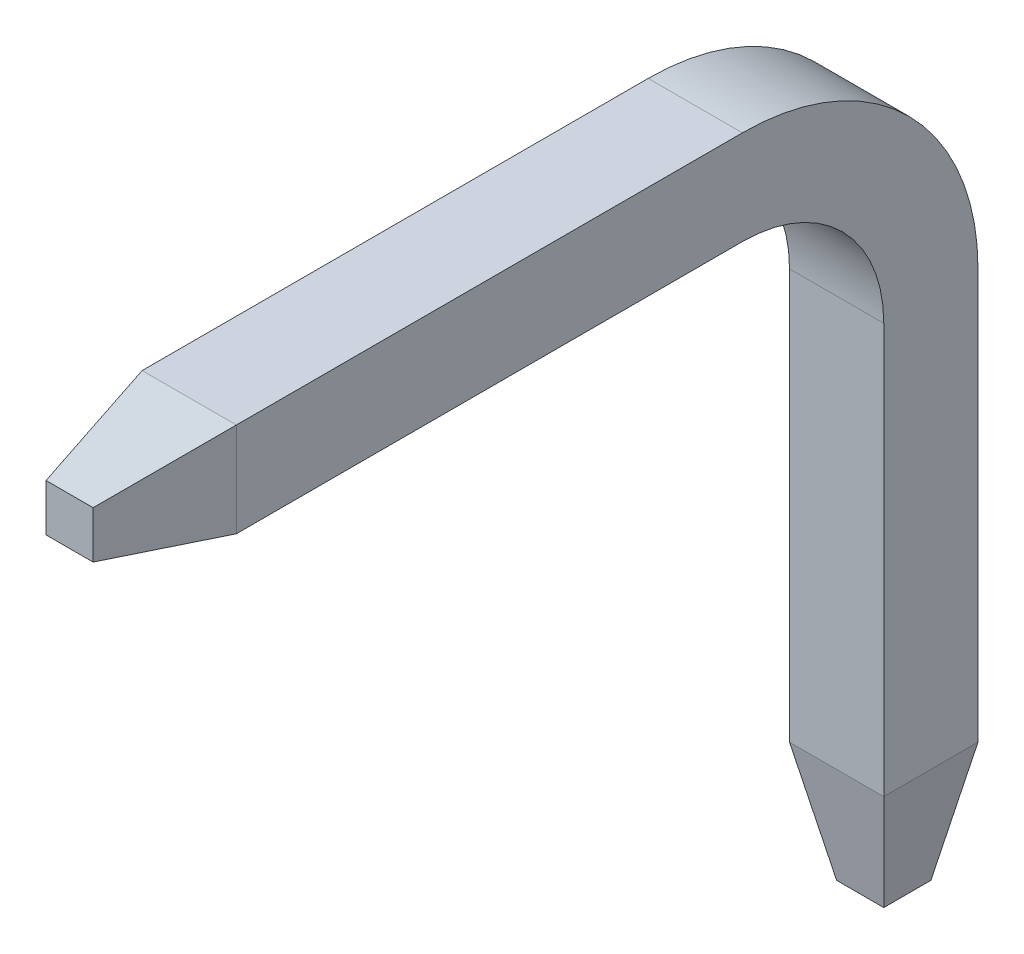
ISO-10303-21;
HEADER;
FILE_DESCRIPTION(('STEP AP214'),'2;1');
FILE_NAME('part.step','',(''),(''),'','','');
FILE_SCHEMA(('AUTOMOTIVE_DESIGN { 1 0 10303 214 1 1 1 1 }'));
ENDSEC;
DATA;
#1=APPLICATION_CONTEXT('core data for automotive mechanical design processes');
#2=APPLICATION_PROTOCOL_DEFINITION('international standard','automotive_design',2000,#1);
#3=PRODUCT_CONTEXT('',#1,'mechanical');
#4=PRODUCT('Part','Part','',(#3));
#5=PRODUCT_RELATED_PRODUCT_CATEGORY('part','',(#4));
#6=PRODUCT_DEFINITION_FORMATION('','',#4);
#7=PRODUCT_DEFINITION_CONTEXT('part definition',#1,'design');
#8=PRODUCT_DEFINITION('design','',#6,#7);
#9=PRODUCT_DEFINITION_SHAPE('','',#8);
#10=(LENGTH_UNIT() NAMED_UNIT(*) SI_UNIT(.MILLI.,.METRE.));
#11=(NAMED_UNIT(*) PLANE_ANGLE_UNIT() SI_UNIT($,.RADIAN.));
#12=(NAMED_UNIT(*) SI_UNIT($,.STERADIAN.) SOLID_ANGLE_UNIT());
#13=UNCERTAINTY_MEASURE_WITH_UNIT(LENGTH_MEASURE(1.E-05),#10,'distance_accuracy_value','');
#14=(GEOMETRIC_REPRESENTATION_CONTEXT(3) GLOBAL_UNCERTAINTY_ASSIGNED_CONTEXT((#13)) GLOBAL_UNIT_ASSIGNED_CONTEXT((#10,
#11,#12)) REPRESENTATION_CONTEXT('',''));
#15=CARTESIAN_POINT('',(0.,0.,0.));
#16=DIRECTION('',(0.,0.,1.));
#17=DIRECTION('',(1.,0.,0.));
#18=AXIS2_PLACEMENT_3D('',#15,#16,#17);
#19=CARTESIAN_POINT('',(0.5,-2.,2.));
#20=DIRECTION('',(-1.,0.,0.));
#21=DIRECTION('',(0.,0.,1.));
#22=AXIS2_PLACEMENT_3D('',#19,#20,#21);
#23=CYLINDRICAL_SURFACE('',#22,2.5);
#24=CARTESIAN_POINT('',(-0.5,-2.,2.));
#25=DIRECTION('',(1.,0.,0.));
#26=DIRECTION('',(0.,0.,1.));
#27=AXIS2_PLACEMENT_3D('',#24,#25,#26);
#28=CIRCLE('',#27,2.5);
#29=CARTESIAN_POINT('',(-0.5,-2.,-0.5));
#30=VERTEX_POINT('',#29);
#31=CARTESIAN_POINT('',(-0.5,0.5,2.));
#32=VERTEX_POINT('',#31);
#33=EDGE_CURVE('E149',#30,#32,#28,.T.);
#34=ORIENTED_EDGE('',*,*,#33,.T.);
#35=DIRECTION('',(-1.,0.,0.));
#36=VECTOR('',#35,1.);
#37=CARTESIAN_POINT('',(0.5,0.5,2.));
#38=LINE('',#37,#36);
#39=CARTESIAN_POINT('',(0.5,0.5,2.));
#40=VERTEX_POINT('',#39);
#41=EDGE_CURVE('E132',#40,#32,#38,.T.);
#42=ORIENTED_EDGE('',*,*,#41,.F.);
#43=CARTESIAN_POINT('',(0.5,-2.,2.));
#44=DIRECTION('',(1.,0.,0.));
#45=DIRECTION('',(0.,0.,1.));
#46=AXIS2_PLACEMENT_3D('',#43,#44,#45);
#47=CIRCLE('',#46,2.5);
#48=CARTESIAN_POINT('',(0.5,-2.,-0.5));
#49=VERTEX_POINT('',#48);
#50=EDGE_CURVE('E138',#49,#40,#47,.T.);
#51=ORIENTED_EDGE('',*,*,#50,.F.);
#52=DIRECTION('',(-1.,0.,0.));
#53=VECTOR('',#52,1.);
#54=CARTESIAN_POINT('',(0.5,-2.,-0.5));
#55=LINE('',#54,#53);
#56=EDGE_CURVE('E400',#49,#30,#55,.T.);
#57=ORIENTED_EDGE('',*,*,#56,.T.);
#58=EDGE_LOOP('',(#34,#42,#51,#57));
#59=FACE_BOUND('',#58,.T.);
#60=ADVANCED_FACE('F35',(#59),#23,.T.);
#61=CARTESIAN_POINT('',(0.5,0.5,2.));
#62=DIRECTION('',(0.,-1.,0.));
#63=DIRECTION('',(0.,0.,-1.));
#64=AXIS2_PLACEMENT_3D('',#61,#62,#63);
#65=PLANE('',#64);
#66=DIRECTION('',(0.,0.,1.));
#67=VECTOR('',#66,1.);
#68=CARTESIAN_POINT('',(-0.5,0.5,2.));
#69=LINE('',#68,#67);
#70=CARTESIAN_POINT('',(-0.5,0.5,7.36999999999998));
#71=VERTEX_POINT('',#70);
#72=EDGE_CURVE('E402',#32,#71,#69,.T.);
#73=ORIENTED_EDGE('',*,*,#72,.T.);
#74=DIRECTION('',(1.,0.,0.));
#75=VECTOR('',#74,1.);
#76=CARTESIAN_POINT('',(0.5,0.5,7.36999999999998));
#77=LINE('',#76,#75);
#78=CARTESIAN_POINT('',(0.5,0.5,7.36999999999998));
#79=VERTEX_POINT('',#78);
#80=EDGE_CURVE('E135',#71,#79,#77,.T.);
#81=ORIENTED_EDGE('',*,*,#80,.T.);
#82=DIRECTION('',(0.,0.,1.));
#83=VECTOR('',#82,1.);
#84=CARTESIAN_POINT('',(0.5,0.5,2.));
#85=LINE('',#84,#83);
#86=EDGE_CURVE('E127',#40,#79,#85,.T.);
#87=ORIENTED_EDGE('',*,*,#86,.F.);
#88=ORIENTED_EDGE('',*,*,#41,.T.);
#89=EDGE_LOOP('',(#73,#81,#87,#88));
#90=FACE_BOUND('',#89,.T.);
#91=ADVANCED_FACE('F130',(#90),#65,.F.);
#92=CARTESIAN_POINT('',(0.5,0.5,8.64));
#93=DIRECTION('',(0.,0.,-1.));
#94=DIRECTION('',(-1.,0.,0.));
#95=AXIS2_PLACEMENT_3D('',#92,#93,#94);
#96=PLANE('',#95);
#97=DIRECTION('',(-1.,0.,0.));
#98=VECTOR('',#97,1.);
#99=CARTESIAN_POINT('',(0.5,0.25,8.64));
#100=LINE('',#99,#98);
#101=CARTESIAN_POINT('',(0.25,0.25,8.64));
#102=VERTEX_POINT('',#101);
#103=CARTESIAN_POINT('',(-0.25,0.25,8.64));
#104=VERTEX_POINT('',#103);
#105=EDGE_CURVE('E150',#102,#104,#100,.T.);
#106=ORIENTED_EDGE('',*,*,#105,.T.);
#107=DIRECTION('',(0.,-1.,0.));
#108=VECTOR('',#107,1.);
#109=CARTESIAN_POINT('',(-0.25,-0.5,8.64));
#110=LINE('',#109,#108);
#111=CARTESIAN_POINT('',(-0.25,-0.25,8.64));
#112=VERTEX_POINT('',#111);
#113=EDGE_CURVE('E163',#104,#112,#110,.T.);
#114=ORIENTED_EDGE('',*,*,#113,.T.);
#115=DIRECTION('',(1.,0.,0.));
#116=VECTOR('',#115,1.);
#117=CARTESIAN_POINT('',(0.5,-0.25,8.64));
#118=LINE('',#117,#116);
#119=CARTESIAN_POINT('',(0.25,-0.25,8.64));
#120=VERTEX_POINT('',#119);
#121=EDGE_CURVE('E161',#112,#120,#118,.T.);
#122=ORIENTED_EDGE('',*,*,#121,.T.);
#123=DIRECTION('',(0.,1.,0.));
#124=VECTOR('',#123,1.);
#125=CARTESIAN_POINT('',(0.25,0.5,8.64));
#126=LINE('',#125,#124);
#127=EDGE_CURVE('E153',#120,#102,#126,.T.);
#128=ORIENTED_EDGE('',*,*,#127,.T.);
#129=EDGE_LOOP('',(#106,#114,#122,#128));
#130=FACE_BOUND('',#129,.T.);
#131=ADVANCED_FACE('F246',(#130),#96,.F.);
#132=CARTESIAN_POINT('',(0.5,-0.5,2.));
#133=DIRECTION('',(0.,1.,0.));
#134=DIRECTION('',(0.,0.,1.));
#135=AXIS2_PLACEMENT_3D('',#132,#133,#134);
#136=PLANE('',#135);
#137=DIRECTION('',(0.,0.,-1.));
#138=VECTOR('',#137,1.);
#139=CARTESIAN_POINT('',(0.5,-0.5,2.));
#140=LINE('',#139,#138);
#141=CARTESIAN_POINT('',(0.5,-0.5,7.36999999999998));
#142=VERTEX_POINT('',#141);
#143=CARTESIAN_POINT('',(0.5,-0.5,2.));
#144=VERTEX_POINT('',#143);
#145=EDGE_CURVE('E137',#142,#144,#140,.T.);
#146=ORIENTED_EDGE('',*,*,#145,.F.);
#147=DIRECTION('',(-1.,0.,0.));
#148=VECTOR('',#147,1.);
#149=CARTESIAN_POINT('',(0.5,-0.5,7.36999999999998));
#150=LINE('',#149,#148);
#151=CARTESIAN_POINT('',(-0.5,-0.5,7.36999999999998));
#152=VERTEX_POINT('',#151);
#153=EDGE_CURVE('E169',#142,#152,#150,.T.);
#154=ORIENTED_EDGE('',*,*,#153,.T.);
#155=DIRECTION('',(0.,0.,-1.));
#156=VECTOR('',#155,1.);
#157=CARTESIAN_POINT('',(-0.5,-0.5,2.));
#158=LINE('',#157,#156);
#159=CARTESIAN_POINT('',(-0.5,-0.5,2.));
#160=VERTEX_POINT('',#159);
#161=EDGE_CURVE('E404',#152,#160,#158,.T.);
#162=ORIENTED_EDGE('',*,*,#161,.T.);
#163=DIRECTION('',(-1.,0.,0.));
#164=VECTOR('',#163,1.);
#165=CARTESIAN_POINT('',(0.5,-0.5,2.));
#166=LINE('',#165,#164);
#167=EDGE_CURVE('E151',#144,#160,#166,.T.);
#168=ORIENTED_EDGE('',*,*,#167,.F.);
#169=EDGE_LOOP('',(#146,#154,#162,#168));
#170=FACE_BOUND('',#169,.T.);
#171=ADVANCED_FACE('F348',(#170),#136,.F.);
#172=CARTESIAN_POINT('',(0.5,-2.,2.));
#173=DIRECTION('',(-1.,0.,0.));
#174=DIRECTION('',(0.,0.,1.));
#175=AXIS2_PLACEMENT_3D('',#172,#173,#174);
#176=CYLINDRICAL_SURFACE('',#175,1.5);
#177=CARTESIAN_POINT('',(-0.5,-2.,2.));
#178=DIRECTION('',(-1.,0.,0.));
#179=DIRECTION('',(0.,0.,1.));
#180=AXIS2_PLACEMENT_3D('',#177,#178,#179);
#181=CIRCLE('',#180,1.5);
#182=CARTESIAN_POINT('',(-0.5,-2.,0.5));
#183=VERTEX_POINT('',#182);
#184=EDGE_CURVE('E406',#160,#183,#181,.T.);
#185=ORIENTED_EDGE('',*,*,#184,.T.);
#186=DIRECTION('',(-1.,0.,0.));
#187=VECTOR('',#186,1.);
#188=CARTESIAN_POINT('',(0.5,-2.,0.5));
#189=LINE('',#188,#187);
#190=CARTESIAN_POINT('',(0.5,-2.,0.5));
#191=VERTEX_POINT('',#190);
#192=EDGE_CURVE('E156',#191,#183,#189,.T.);
#193=ORIENTED_EDGE('',*,*,#192,.F.);
#194=CARTESIAN_POINT('',(0.5,-2.,2.));
#195=DIRECTION('',(-1.,0.,0.));
#196=DIRECTION('',(0.,0.,1.));
#197=AXIS2_PLACEMENT_3D('',#194,#195,#196);
#198=CIRCLE('',#197,1.5);
#199=EDGE_CURVE('E393',#144,#191,#198,.T.);
#200=ORIENTED_EDGE('',*,*,#199,.F.);
#201=ORIENTED_EDGE('',*,*,#167,.T.);
#202=EDGE_LOOP('',(#185,#193,#200,#201));
#203=FACE_BOUND('',#202,.T.);
#204=ADVANCED_FACE('F239',(#203),#176,.F.);
#205=CARTESIAN_POINT('',(0.5,-2.,0.5));
#206=DIRECTION('',(0.,0.,-1.));
#207=DIRECTION('',(-1.,0.,0.));
#208=AXIS2_PLACEMENT_3D('',#205,#206,#207);
#209=PLANE('',#208);
#210=DIRECTION('',(0.,-1.,0.));
#211=VECTOR('',#210,1.);
#212=CARTESIAN_POINT('',(-0.5,-2.,0.5));
#213=LINE('',#212,#211);
#214=CARTESIAN_POINT('',(-0.5,-6.34999999999997,0.5));
#215=VERTEX_POINT('',#214);
#216=EDGE_CURVE('E224',#183,#215,#213,.T.);
#217=ORIENTED_EDGE('',*,*,#216,.T.);
#218=DIRECTION('',(1.,0.,0.));
#219=VECTOR('',#218,1.);
#220=CARTESIAN_POINT('',(0.5,-6.34999999999997,0.5));
#221=LINE('',#220,#219);
#222=CARTESIAN_POINT('',(0.5,-6.34999999999997,0.5));
#223=VERTEX_POINT('',#222);
#224=EDGE_CURVE('E60',#215,#223,#221,.T.);
#225=ORIENTED_EDGE('',*,*,#224,.T.);
#226=DIRECTION('',(0.,-1.,0.));
#227=VECTOR('',#226,1.);
#228=CARTESIAN_POINT('',(0.5,-2.,0.5));
#229=LINE('',#228,#227);
#230=EDGE_CURVE('E395',#191,#223,#229,.T.);
#231=ORIENTED_EDGE('',*,*,#230,.F.);
#232=ORIENTED_EDGE('',*,*,#192,.T.);
#233=EDGE_LOOP('',(#217,#225,#231,#232));
#234=FACE_BOUND('',#233,.T.);
#235=ADVANCED_FACE('F232',(#234),#209,.F.);
#236=CARTESIAN_POINT('',(0.5,-7.62,-0.5));
#237=DIRECTION('',(0.,1.,0.));
#238=DIRECTION('',(0.,0.,1.));
#239=AXIS2_PLACEMENT_3D('',#236,#237,#238);
#240=PLANE('',#239);
#241=DIRECTION('',(-1.,0.,0.));
#242=VECTOR('',#241,1.);
#243=CARTESIAN_POINT('',(0.5,-7.62,0.249999999999999));
#244=LINE('',#243,#242);
#245=CARTESIAN_POINT('',(0.249999999999999,-7.62,0.249999999999999));
#246=VERTEX_POINT('',#245);
#247=CARTESIAN_POINT('',(-0.249999999999999,-7.62,0.249999999999999));
#248=VERTEX_POINT('',#247);
#249=EDGE_CURVE('E188',#246,#248,#244,.T.);
#250=ORIENTED_EDGE('',*,*,#249,.T.);
#251=DIRECTION('',(0.,0.,-1.));
#252=VECTOR('',#251,1.);
#253=CARTESIAN_POINT('',(-0.249999999999999,-7.62,-0.5));
#254=LINE('',#253,#252);
#255=CARTESIAN_POINT('',(-0.249999999999999,-7.62,-0.249999999999999));
#256=VERTEX_POINT('',#255);
#257=EDGE_CURVE('E190',#248,#256,#254,.T.);
#258=ORIENTED_EDGE('',*,*,#257,.T.);
#259=DIRECTION('',(1.,0.,0.));
#260=VECTOR('',#259,1.);
#261=CARTESIAN_POINT('',(0.5,-7.62,-0.249999999999999));
#262=LINE('',#261,#260);
#263=CARTESIAN_POINT('',(0.249999999999999,-7.62,-0.249999999999999));
#264=VERTEX_POINT('',#263);
#265=EDGE_CURVE('E174',#256,#264,#262,.T.);
#266=ORIENTED_EDGE('',*,*,#265,.T.);
#267=DIRECTION('',(0.,0.,1.));
#268=VECTOR('',#267,1.);
#269=CARTESIAN_POINT('',(0.249999999999999,-7.62,-0.5));
#270=LINE('',#269,#268);
#271=EDGE_CURVE('E186',#264,#246,#270,.T.);
#272=ORIENTED_EDGE('',*,*,#271,.T.);
#273=EDGE_LOOP('',(#250,#258,#266,#272));
#274=FACE_BOUND('',#273,.T.);
#275=ADVANCED_FACE('F230',(#274),#240,.F.);
#276=CARTESIAN_POINT('',(0.5,-2.,-0.5));
#277=DIRECTION('',(0.,0.,1.));
#278=DIRECTION('',(1.,0.,0.));
#279=AXIS2_PLACEMENT_3D('',#276,#277,#278);
#280=PLANE('',#279);
#281=DIRECTION('',(0.,1.,0.));
#282=VECTOR('',#281,1.);
#283=CARTESIAN_POINT('',(0.5,-2.,-0.5));
#284=LINE('',#283,#282);
#285=CARTESIAN_POINT('',(0.5,-6.34999999999997,-0.5));
#286=VERTEX_POINT('',#285);
#287=EDGE_CURVE('E142',#286,#49,#284,.T.);
#288=ORIENTED_EDGE('',*,*,#287,.F.);
#289=DIRECTION('',(-1.,0.,0.));
#290=VECTOR('',#289,1.);
#291=CARTESIAN_POINT('',(0.5,-6.34999999999997,-0.5));
#292=LINE('',#291,#290);
#293=CARTESIAN_POINT('',(-0.5,-6.34999999999997,-0.5));
#294=VERTEX_POINT('',#293);
#295=EDGE_CURVE('E11',#286,#294,#292,.T.);
#296=ORIENTED_EDGE('',*,*,#295,.T.);
#297=DIRECTION('',(0.,1.,0.));
#298=VECTOR('',#297,1.);
#299=CARTESIAN_POINT('',(-0.5,-2.,-0.5));
#300=LINE('',#299,#298);
#301=EDGE_CURVE('E146',#294,#30,#300,.T.);
#302=ORIENTED_EDGE('',*,*,#301,.T.);
#303=ORIENTED_EDGE('',*,*,#56,.F.);
#304=EDGE_LOOP('',(#288,#296,#302,#303));
#305=FACE_BOUND('',#304,.T.);
#306=ADVANCED_FACE('F219',(#305),#280,.F.);
#307=CARTESIAN_POINT('',(0.5,-2.,2.));
#308=DIRECTION('',(-1.,0.,0.));
#309=DIRECTION('',(0.,0.,1.));
#310=AXIS2_PLACEMENT_3D('',#307,#308,#309);
#311=PLANE('',#310);
#312=ORIENTED_EDGE('',*,*,#230,.T.);
#313=DIRECTION('',(0.,0.,-1.));
#314=VECTOR('',#313,1.);
#315=CARTESIAN_POINT('',(0.5,-6.34999999999997,2.));
#316=LINE('',#315,#314);
#317=EDGE_CURVE('E45',#223,#286,#316,.T.);
#318=ORIENTED_EDGE('',*,*,#317,.T.);
#319=ORIENTED_EDGE('',*,*,#287,.T.);
#320=ORIENTED_EDGE('',*,*,#50,.T.);
#321=ORIENTED_EDGE('',*,*,#86,.T.);
#322=DIRECTION('',(0.,-1.,0.));
#323=VECTOR('',#322,1.);
#324=CARTESIAN_POINT('',(0.5,-2.,7.36999999999998));
#325=LINE('',#324,#323);
#326=EDGE_CURVE('E171',#79,#142,#325,.T.);
#327=ORIENTED_EDGE('',*,*,#326,.T.);
#328=ORIENTED_EDGE('',*,*,#145,.T.);
#329=ORIENTED_EDGE('',*,*,#199,.T.);
#330=EDGE_LOOP('',(#312,#318,#319,#320,#321,#327,#328,#329));
#331=FACE_BOUND('',#330,.T.);
#332=ADVANCED_FACE('F141',(#331),#311,.F.);
#333=CARTESIAN_POINT('',(-0.5,-2.,2.));
#334=DIRECTION('',(-1.,0.,0.));
#335=DIRECTION('',(0.,0.,1.));
#336=AXIS2_PLACEMENT_3D('',#333,#334,#335);
#337=PLANE('',#336);
#338=ORIENTED_EDGE('',*,*,#301,.F.);
#339=DIRECTION('',(0.,0.,1.));
#340=VECTOR('',#339,1.);
#341=CARTESIAN_POINT('',(-0.5,-6.34999999999997,0.5));
#342=LINE('',#341,#340);
#343=EDGE_CURVE('E193',#294,#215,#342,.T.);
#344=ORIENTED_EDGE('',*,*,#343,.T.);
#345=ORIENTED_EDGE('',*,*,#216,.F.);
#346=ORIENTED_EDGE('',*,*,#184,.F.);
#347=ORIENTED_EDGE('',*,*,#161,.F.);
#348=DIRECTION('',(0.,1.,0.));
#349=VECTOR('',#348,1.);
#350=CARTESIAN_POINT('',(-0.5,0.5,7.36999999999998));
#351=LINE('',#350,#349);
#352=EDGE_CURVE('E166',#152,#71,#351,.T.);
#353=ORIENTED_EDGE('',*,*,#352,.T.);
#354=ORIENTED_EDGE('',*,*,#72,.F.);
#355=ORIENTED_EDGE('',*,*,#33,.F.);
#356=EDGE_LOOP('',(#338,#344,#345,#346,#347,#353,#354,#355));
#357=FACE_BOUND('',#356,.T.);
#358=ADVANCED_FACE('F222',(#357),#337,.T.);
#359=CARTESIAN_POINT('',(0.5,-2.,7.36999999999998));
#360=DIRECTION('',(-0.981170462104977,0.,-0.193143791752945));
#361=DIRECTION('',(0.,-1.,0.));
#362=AXIS2_PLACEMENT_3D('',#359,#360,#361);
#363=PLANE('',#362);
#364=DIRECTION('',(0.189638982761259,-0.189638982761259,-0.963366032427213));
#365=VECTOR('',#364,1.);
#366=CARTESIAN_POINT('',(0.553944415674088,-0.553944415674088,7.09596236837561));
#367=LINE('',#366,#365);
#368=EDGE_CURVE('E179',#142,#120,#367,.F.);
#369=ORIENTED_EDGE('',*,*,#368,.F.);
#370=ORIENTED_EDGE('',*,*,#326,.F.);
#371=DIRECTION('',(0.189638982761259,0.189638982761259,-0.963366032427213));
#372=VECTOR('',#371,1.);
#373=CARTESIAN_POINT('',(0.258990735945681,0.258990735945681,8.59432706139594));
#374=LINE('',#373,#372);
#375=EDGE_CURVE('E182',#102,#79,#374,.T.);
#376=ORIENTED_EDGE('',*,*,#375,.F.);
#377=ORIENTED_EDGE('',*,*,#127,.F.);
#378=EDGE_LOOP('',(#369,#370,#376,#377));
#379=FACE_BOUND('',#378,.T.);
#380=ADVANCED_FACE('F271',(#379),#363,.F.);
#381=CARTESIAN_POINT('',(0.5,0.25,8.64));
#382=DIRECTION('',(0.,-0.981170462104977,-0.193143791752945));
#383=DIRECTION('',(-1.,0.,0.));
#384=AXIS2_PLACEMENT_3D('',#381,#382,#383);
#385=PLANE('',#384);
#386=ORIENTED_EDGE('',*,*,#375,.T.);
#387=ORIENTED_EDGE('',*,*,#80,.F.);
#388=DIRECTION('',(-0.189638982761259,0.189638982761259,-0.963366032427213));
#389=VECTOR('',#388,1.);
#390=CARTESIAN_POINT('',(-0.223027792162956,0.223027792162956,8.77701881581219));
#391=LINE('',#390,#389);
#392=EDGE_CURVE('E177',#104,#71,#391,.T.);
#393=ORIENTED_EDGE('',*,*,#392,.F.);
#394=ORIENTED_EDGE('',*,*,#105,.F.);
#395=EDGE_LOOP('',(#386,#387,#393,#394));
#396=FACE_BOUND('',#395,.T.);
#397=ADVANCED_FACE('F264',(#396),#385,.F.);
#398=CARTESIAN_POINT('',(0.5,-0.5,7.36999999999998));
#399=DIRECTION('',(0.,0.981170462104977,-0.193143791752945));
#400=DIRECTION('',(-1.,0.,0.));
#401=AXIS2_PLACEMENT_3D('',#398,#399,#400);
#402=PLANE('',#401);
#403=ORIENTED_EDGE('',*,*,#368,.T.);
#404=ORIENTED_EDGE('',*,*,#121,.F.);
#405=DIRECTION('',(0.189638982761259,0.189638982761259,0.963366032427213));
#406=VECTOR('',#405,1.);
#407=CARTESIAN_POINT('',(-0.464037056217275,-0.464037056217275,7.55269175441623));
#408=LINE('',#407,#406);
#409=EDGE_CURVE('E175',#152,#112,#408,.T.);
#410=ORIENTED_EDGE('',*,*,#409,.F.);
#411=ORIENTED_EDGE('',*,*,#153,.F.);
#412=EDGE_LOOP('',(#403,#404,#410,#411));
#413=FACE_BOUND('',#412,.T.);
#414=ADVANCED_FACE('F257',(#413),#402,.F.);
#415=CARTESIAN_POINT('',(-0.25,0.5,8.64));
#416=DIRECTION('',(-0.981170462104977,0.,0.193143791752945));
#417=DIRECTION('',(0.,1.,0.));
#418=AXIS2_PLACEMENT_3D('',#415,#416,#417);
#419=PLANE('',#418);
#420=ORIENTED_EDGE('',*,*,#392,.T.);
#421=ORIENTED_EDGE('',*,*,#352,.F.);
#422=ORIENTED_EDGE('',*,*,#409,.T.);
#423=ORIENTED_EDGE('',*,*,#113,.F.);
#424=EDGE_LOOP('',(#420,#421,#422,#423));
#425=FACE_BOUND('',#424,.T.);
#426=ADVANCED_FACE('F251',(#425),#419,.T.);
#427=CARTESIAN_POINT('',(0.5,-6.34999999999997,2.));
#428=DIRECTION('',(-0.981170462104978,0.193143791752945,0.));
#429=DIRECTION('',(0.,0.,-1.));
#430=AXIS2_PLACEMENT_3D('',#427,#428,#429);
#431=PLANE('',#430);
#432=DIRECTION('',(-0.189638982761259,-0.963366032427213,0.189638982761259));
#433=VECTOR('',#432,1.);
#434=CARTESIAN_POINT('',(0.5,-6.34999999999997,-0.5));
#435=LINE('',#434,#433);
#436=EDGE_CURVE('E201',#286,#264,#435,.T.);
#437=ORIENTED_EDGE('',*,*,#436,.F.);
#438=ORIENTED_EDGE('',*,*,#317,.F.);
#439=DIRECTION('',(-0.189638982761259,-0.963366032427213,-0.189638982761259));
#440=VECTOR('',#439,1.);
#441=CARTESIAN_POINT('',(0.553944415674088,-6.0759623683756,0.553944415674088));
#442=LINE('',#441,#440);
#443=EDGE_CURVE('E40',#246,#223,#442,.F.);
#444=ORIENTED_EDGE('',*,*,#443,.F.);
#445=ORIENTED_EDGE('',*,*,#271,.F.);
#446=EDGE_LOOP('',(#437,#438,#444,#445));
#447=FACE_BOUND('',#446,.T.);
#448=ADVANCED_FACE('F38',(#447),#431,.F.);
#449=CARTESIAN_POINT('',(0.5,-7.62,0.249999999999999));
#450=DIRECTION('',(0.,0.193143791752945,-0.981170462104978));
#451=DIRECTION('',(-1.,0.,0.));
#452=AXIS2_PLACEMENT_3D('',#449,#450,#451);
#453=PLANE('',#452);
#454=ORIENTED_EDGE('',*,*,#443,.T.);
#455=ORIENTED_EDGE('',*,*,#224,.F.);
#456=DIRECTION('',(-0.189638982761259,0.963366032427213,0.189638982761259));
#457=VECTOR('',#456,1.);
#458=CARTESIAN_POINT('',(-0.223027792162956,-7.75701881581219,0.223027792162956));
#459=LINE('',#458,#457);
#460=EDGE_CURVE('E200',#248,#215,#459,.T.);
#461=ORIENTED_EDGE('',*,*,#460,.F.);
#462=ORIENTED_EDGE('',*,*,#249,.F.);
#463=EDGE_LOOP('',(#454,#455,#461,#462));
#464=FACE_BOUND('',#463,.T.);
#465=ADVANCED_FACE('F211',(#464),#453,.F.);
#466=CARTESIAN_POINT('',(0.5,-6.34999999999997,-0.5));
#467=DIRECTION('',(0.,0.193143791752945,0.981170462104978));
#468=DIRECTION('',(-1.,0.,0.));
#469=AXIS2_PLACEMENT_3D('',#466,#467,#468);
#470=PLANE('',#469);
#471=ORIENTED_EDGE('',*,*,#436,.T.);
#472=ORIENTED_EDGE('',*,*,#265,.F.);
#473=DIRECTION('',(0.189638982761259,-0.963366032427213,0.189638982761259));
#474=VECTOR('',#473,1.);
#475=CARTESIAN_POINT('',(-0.464037056217275,-6.53269175441622,-0.464037056217275));
#476=LINE('',#475,#474);
#477=EDGE_CURVE('E198',#294,#256,#476,.T.);
#478=ORIENTED_EDGE('',*,*,#477,.F.);
#479=ORIENTED_EDGE('',*,*,#295,.F.);
#480=EDGE_LOOP('',(#471,#472,#478,#479));
#481=FACE_BOUND('',#480,.T.);
#482=ADVANCED_FACE('F216',(#481),#470,.F.);
#483=CARTESIAN_POINT('',(-0.249999999999999,-7.62,-0.5));
#484=DIRECTION('',(-0.981170462104978,-0.193143791752945,0.));
#485=DIRECTION('',(0.,0.,1.));
#486=AXIS2_PLACEMENT_3D('',#483,#484,#485);
#487=PLANE('',#486);
#488=ORIENTED_EDGE('',*,*,#460,.T.);
#489=ORIENTED_EDGE('',*,*,#343,.F.);
#490=ORIENTED_EDGE('',*,*,#477,.T.);
#491=ORIENTED_EDGE('',*,*,#257,.F.);
#492=EDGE_LOOP('',(#488,#489,#490,#491));
#493=FACE_BOUND('',#492,.T.);
#494=ADVANCED_FACE('F227',(#493),#487,.T.);
#495=CLOSED_SHELL('',(#60,#91,#131,#171,#204,#235,#275,#306,#332,#358,#380,#397,#414,#426,#448,
#465,#482,#494));
#496=MANIFOLD_SOLID_BREP('B2',#495);
#497=ADVANCED_BREP_SHAPE_REPRESENTATION('',(#18,#496),#14);
#498=SHAPE_DEFINITION_REPRESENTATION(#9,#497);
ENDSEC;
END-ISO-10303-21;
